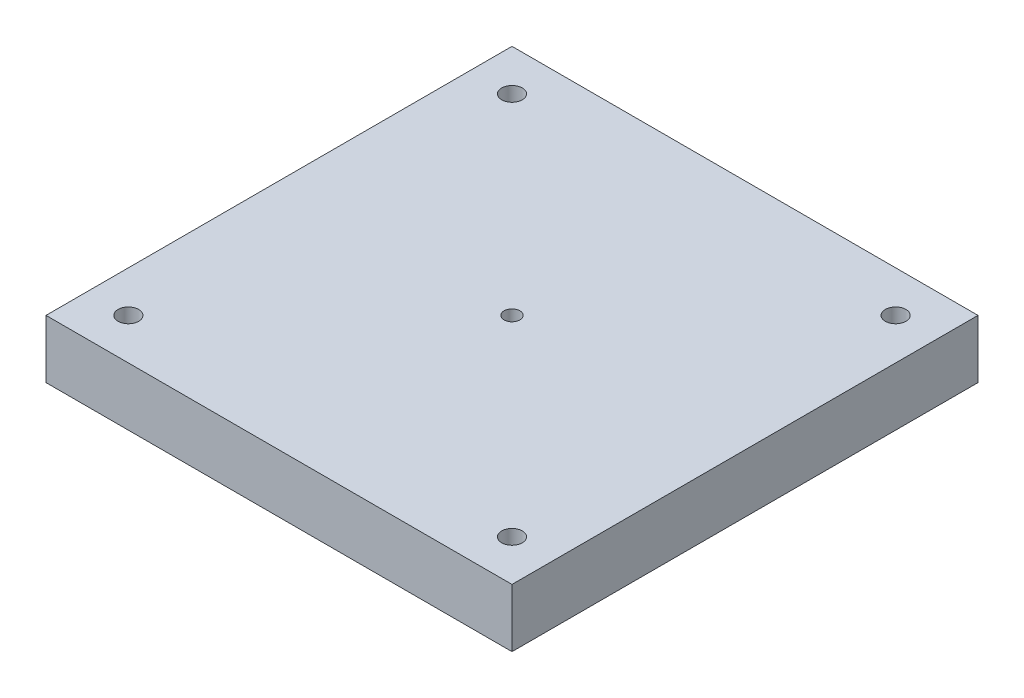
ISO-10303-21;
HEADER;
FILE_DESCRIPTION(('STEP AP214'),'2;1');
FILE_NAME('part.step','',(''),(''),'','','');
FILE_SCHEMA(('AUTOMOTIVE_DESIGN { 1 0 10303 214 1 1 1 1 }'));
ENDSEC;
DATA;
#1=APPLICATION_CONTEXT('core data for automotive mechanical design processes');
#2=APPLICATION_PROTOCOL_DEFINITION('international standard','automotive_design',2000,#1);
#3=PRODUCT_CONTEXT('',#1,'mechanical');
#4=PRODUCT('Part','Part','',(#3));
#5=PRODUCT_RELATED_PRODUCT_CATEGORY('part','',(#4));
#6=PRODUCT_DEFINITION_FORMATION('','',#4);
#7=PRODUCT_DEFINITION_CONTEXT('part definition',#1,'design');
#8=PRODUCT_DEFINITION('design','',#6,#7);
#9=PRODUCT_DEFINITION_SHAPE('','',#8);
#10=(LENGTH_UNIT() NAMED_UNIT(*) SI_UNIT(.MILLI.,.METRE.));
#11=(NAMED_UNIT(*) PLANE_ANGLE_UNIT() SI_UNIT($,.RADIAN.));
#12=(NAMED_UNIT(*) SI_UNIT($,.STERADIAN.) SOLID_ANGLE_UNIT());
#13=UNCERTAINTY_MEASURE_WITH_UNIT(LENGTH_MEASURE(1.E-05),#10,'distance_accuracy_value','');
#14=(GEOMETRIC_REPRESENTATION_CONTEXT(3) GLOBAL_UNCERTAINTY_ASSIGNED_CONTEXT((#13)) GLOBAL_UNIT_ASSIGNED_CONTEXT((#10,
#11,#12)) REPRESENTATION_CONTEXT('',''));
#15=CARTESIAN_POINT('',(0.,0.,0.));
#16=DIRECTION('',(0.,0.,1.));
#17=DIRECTION('',(1.,0.,0.));
#18=AXIS2_PLACEMENT_3D('',#15,#16,#17);
#19=CARTESIAN_POINT('',(50.8,-12.7,-50.8));
#20=DIRECTION('',(1.,0.,0.));
#21=DIRECTION('',(0.,0.,-1.));
#22=AXIS2_PLACEMENT_3D('',#19,#20,#21);
#23=PLANE('',#22);
#24=DIRECTION('',(0.,0.,-1.));
#25=VECTOR('',#24,1.);
#26=CARTESIAN_POINT('',(50.8,0.,-50.8));
#27=LINE('',#26,#25);
#28=CARTESIAN_POINT('',(50.8,0.,50.8));
#29=VERTEX_POINT('',#28);
#30=CARTESIAN_POINT('',(50.8,0.,-50.8));
#31=VERTEX_POINT('',#30);
#32=EDGE_CURVE('E113',#29,#31,#27,.T.);
#33=ORIENTED_EDGE('',*,*,#32,.F.);
#34=DIRECTION('',(0.,1.,0.));
#35=VECTOR('',#34,1.);
#36=CARTESIAN_POINT('',(50.8,-12.7,50.8));
#37=LINE('',#36,#35);
#38=CARTESIAN_POINT('',(50.8,-12.7,50.8));
#39=VERTEX_POINT('',#38);
#40=EDGE_CURVE('E11',#39,#29,#37,.T.);
#41=ORIENTED_EDGE('',*,*,#40,.F.);
#42=DIRECTION('',(0.,0.,-1.));
#43=VECTOR('',#42,1.);
#44=CARTESIAN_POINT('',(50.8,-12.7,-50.8));
#45=LINE('',#44,#43);
#46=CARTESIAN_POINT('',(50.8,-12.7,-50.8));
#47=VERTEX_POINT('',#46);
#48=EDGE_CURVE('E104',#39,#47,#45,.T.);
#49=ORIENTED_EDGE('',*,*,#48,.T.);
#50=DIRECTION('',(0.,1.,0.));
#51=VECTOR('',#50,1.);
#52=CARTESIAN_POINT('',(50.8,-12.7,-50.8));
#53=LINE('',#52,#51);
#54=EDGE_CURVE('E45',#47,#31,#53,.T.);
#55=ORIENTED_EDGE('',*,*,#54,.T.);
#56=EDGE_LOOP('',(#33,#41,#49,#55));
#57=FACE_BOUND('',#56,.T.);
#58=ADVANCED_FACE('F42',(#57),#23,.T.);
#59=CARTESIAN_POINT('',(-50.8,-12.7,50.8));
#60=DIRECTION('',(0.,0.,1.));
#61=DIRECTION('',(1.,0.,0.));
#62=AXIS2_PLACEMENT_3D('',#59,#60,#61);
#63=PLANE('',#62);
#64=DIRECTION('',(1.,0.,0.));
#65=VECTOR('',#64,1.);
#66=CARTESIAN_POINT('',(-50.8,0.,50.8));
#67=LINE('',#66,#65);
#68=CARTESIAN_POINT('',(-50.8,0.,50.8));
#69=VERTEX_POINT('',#68);
#70=EDGE_CURVE('E107',#69,#29,#67,.T.);
#71=ORIENTED_EDGE('',*,*,#70,.F.);
#72=DIRECTION('',(0.,1.,0.));
#73=VECTOR('',#72,1.);
#74=CARTESIAN_POINT('',(-50.8,-12.7,50.8));
#75=LINE('',#74,#73);
#76=CARTESIAN_POINT('',(-50.8,-12.7,50.8));
#77=VERTEX_POINT('',#76);
#78=EDGE_CURVE('E52',#77,#69,#75,.T.);
#79=ORIENTED_EDGE('',*,*,#78,.F.);
#80=DIRECTION('',(1.,0.,0.));
#81=VECTOR('',#80,1.);
#82=CARTESIAN_POINT('',(-50.8,-12.7,50.8));
#83=LINE('',#82,#81);
#84=EDGE_CURVE('E99',#77,#39,#83,.T.);
#85=ORIENTED_EDGE('',*,*,#84,.T.);
#86=ORIENTED_EDGE('',*,*,#40,.T.);
#87=EDGE_LOOP('',(#71,#79,#85,#86));
#88=FACE_BOUND('',#87,.T.);
#89=ADVANCED_FACE('F130',(#88),#63,.T.);
#90=CARTESIAN_POINT('',(-50.8,-12.7,-50.8));
#91=DIRECTION('',(-1.,0.,0.));
#92=DIRECTION('',(0.,0.,1.));
#93=AXIS2_PLACEMENT_3D('',#90,#91,#92);
#94=PLANE('',#93);
#95=DIRECTION('',(0.,0.,1.));
#96=VECTOR('',#95,1.);
#97=CARTESIAN_POINT('',(-50.8,0.,-50.8));
#98=LINE('',#97,#96);
#99=CARTESIAN_POINT('',(-50.8,0.,-50.8));
#100=VERTEX_POINT('',#99);
#101=EDGE_CURVE('E93',#100,#69,#98,.T.);
#102=ORIENTED_EDGE('',*,*,#101,.F.);
#103=DIRECTION('',(0.,1.,0.));
#104=VECTOR('',#103,1.);
#105=CARTESIAN_POINT('',(-50.8,-12.7,-50.8));
#106=LINE('',#105,#104);
#107=CARTESIAN_POINT('',(-50.8,-12.7,-50.8));
#108=VERTEX_POINT('',#107);
#109=EDGE_CURVE('E88',#108,#100,#106,.T.);
#110=ORIENTED_EDGE('',*,*,#109,.F.);
#111=DIRECTION('',(0.,0.,1.));
#112=VECTOR('',#111,1.);
#113=CARTESIAN_POINT('',(-50.8,-12.7,-50.8));
#114=LINE('',#113,#112);
#115=EDGE_CURVE('E91',#108,#77,#114,.T.);
#116=ORIENTED_EDGE('',*,*,#115,.T.);
#117=ORIENTED_EDGE('',*,*,#78,.T.);
#118=EDGE_LOOP('',(#102,#110,#116,#117));
#119=FACE_BOUND('',#118,.T.);
#120=ADVANCED_FACE('F90',(#119),#94,.T.);
#121=CARTESIAN_POINT('',(-50.8,-12.7,-50.8));
#122=DIRECTION('',(0.,0.,-1.));
#123=DIRECTION('',(-1.,0.,0.));
#124=AXIS2_PLACEMENT_3D('',#121,#122,#123);
#125=PLANE('',#124);
#126=DIRECTION('',(-1.,0.,0.));
#127=VECTOR('',#126,1.);
#128=CARTESIAN_POINT('',(-50.8,0.,-50.8));
#129=LINE('',#128,#127);
#130=EDGE_CURVE('E117',#31,#100,#129,.T.);
#131=ORIENTED_EDGE('',*,*,#130,.F.);
#132=ORIENTED_EDGE('',*,*,#54,.F.);
#133=DIRECTION('',(-1.,0.,0.));
#134=VECTOR('',#133,1.);
#135=CARTESIAN_POINT('',(-50.8,-12.7,-50.8));
#136=LINE('',#135,#134);
#137=EDGE_CURVE('E98',#47,#108,#136,.T.);
#138=ORIENTED_EDGE('',*,*,#137,.T.);
#139=ORIENTED_EDGE('',*,*,#109,.T.);
#140=EDGE_LOOP('',(#131,#132,#138,#139));
#141=FACE_BOUND('',#140,.T.);
#142=ADVANCED_FACE('F102',(#141),#125,.T.);
#143=CARTESIAN_POINT('',(0.,-12.7,0.));
#144=DIRECTION('',(0.,1.,0.));
#145=DIRECTION('',(0.,0.,1.));
#146=AXIS2_PLACEMENT_3D('',#143,#144,#145);
#147=PLANE('',#146);
#148=CARTESIAN_POINT('',(-41.8197438789284,-12.7,41.8197438789309));
#149=DIRECTION('',(0.,1.,0.));
#150=DIRECTION('',(0.,0.,1.));
#151=AXIS2_PLACEMENT_3D('',#148,#149,#150);
#152=CIRCLE('',#151,2.2479);
#153=CARTESIAN_POINT('',(-41.8197438789284,-12.7,44.0676438789309));
#154=VERTEX_POINT('',#153);
#155=EDGE_CURVE('E209',#154,#154,#152,.T.);
#156=ORIENTED_EDGE('',*,*,#155,.T.);
#157=EDGE_LOOP('',(#156));
#158=FACE_BOUND('',#157,.T.);
#159=CARTESIAN_POINT('',(41.8197438789333,-12.7,41.8197438789284));
#160=DIRECTION('',(0.,1.,0.));
#161=DIRECTION('',(0.,0.,1.));
#162=AXIS2_PLACEMENT_3D('',#159,#160,#161);
#163=CIRCLE('',#162,2.2479);
#164=CARTESIAN_POINT('',(41.8197438789333,-12.7,44.0676438789284));
#165=VERTEX_POINT('',#164);
#166=EDGE_CURVE('E201',#165,#165,#163,.T.);
#167=ORIENTED_EDGE('',*,*,#166,.T.);
#168=EDGE_LOOP('',(#167));
#169=FACE_BOUND('',#168,.T.);
#170=CARTESIAN_POINT('',(41.8197438789309,-12.7,-41.8197438789333));
#171=DIRECTION('',(0.,1.,0.));
#172=DIRECTION('',(0.,0.,1.));
#173=AXIS2_PLACEMENT_3D('',#170,#171,#172);
#174=CIRCLE('',#173,2.2479);
#175=CARTESIAN_POINT('',(41.8197438789309,-12.7,-39.5718438789333));
#176=VERTEX_POINT('',#175);
#177=EDGE_CURVE('E193',#176,#176,#174,.T.);
#178=ORIENTED_EDGE('',*,*,#177,.T.);
#179=EDGE_LOOP('',(#178));
#180=FACE_BOUND('',#179,.T.);
#181=CARTESIAN_POINT('',(-41.8197438789309,-12.7,-41.8197438789309));
#182=DIRECTION('',(0.,1.,0.));
#183=DIRECTION('',(0.,0.,1.));
#184=AXIS2_PLACEMENT_3D('',#181,#182,#183);
#185=CIRCLE('',#184,2.2479);
#186=CARTESIAN_POINT('',(-41.8197438789309,-12.7,-39.5718438789309));
#187=VERTEX_POINT('',#186);
#188=EDGE_CURVE('E176',#187,#187,#185,.T.);
#189=ORIENTED_EDGE('',*,*,#188,.T.);
#190=EDGE_LOOP('',(#189));
#191=FACE_BOUND('',#190,.T.);
#192=CARTESIAN_POINT('',(0.,-12.7,0.));
#193=DIRECTION('',(0.,1.,0.));
#194=DIRECTION('',(0.,0.,1.));
#195=AXIS2_PLACEMENT_3D('',#192,#193,#194);
#196=CIRCLE('',#195,1.7272);
#197=CARTESIAN_POINT('',(0.,-12.7,1.72719999999999));
#198=VERTEX_POINT('',#197);
#199=EDGE_CURVE('E118',#198,#198,#196,.T.);
#200=ORIENTED_EDGE('',*,*,#199,.T.);
#201=EDGE_LOOP('',(#200));
#202=FACE_BOUND('',#201,.T.);
#203=ORIENTED_EDGE('',*,*,#48,.F.);
#204=ORIENTED_EDGE('',*,*,#84,.F.);
#205=ORIENTED_EDGE('',*,*,#115,.F.);
#206=ORIENTED_EDGE('',*,*,#137,.F.);
#207=EDGE_LOOP('',(#203,#204,#205,#206));
#208=FACE_BOUND('',#207,.T.);
#209=ADVANCED_FACE('F97',(#158,#169,#180,#191,#202,#208),#147,.F.);
#210=CARTESIAN_POINT('',(0.,0.,0.));
#211=DIRECTION('',(0.,1.,0.));
#212=DIRECTION('',(0.,0.,1.));
#213=AXIS2_PLACEMENT_3D('',#210,#211,#212);
#214=PLANE('',#213);
#215=CARTESIAN_POINT('',(-41.8197438789284,0.,41.8197438789309));
#216=DIRECTION('',(0.,1.,0.));
#217=DIRECTION('',(0.,0.,1.));
#218=AXIS2_PLACEMENT_3D('',#215,#216,#217);
#219=CIRCLE('',#218,2.2479);
#220=CARTESIAN_POINT('',(-41.8197438789284,0.,44.0676438789309));
#221=VERTEX_POINT('',#220);
#222=EDGE_CURVE('E205',#221,#221,#219,.T.);
#223=ORIENTED_EDGE('',*,*,#222,.F.);
#224=EDGE_LOOP('',(#223));
#225=FACE_BOUND('',#224,.T.);
#226=CARTESIAN_POINT('',(41.8197438789333,0.,41.8197438789284));
#227=DIRECTION('',(0.,1.,0.));
#228=DIRECTION('',(0.,0.,1.));
#229=AXIS2_PLACEMENT_3D('',#226,#227,#228);
#230=CIRCLE('',#229,2.2479);
#231=CARTESIAN_POINT('',(41.8197438789333,0.,44.0676438789284));
#232=VERTEX_POINT('',#231);
#233=EDGE_CURVE('E197',#232,#232,#230,.T.);
#234=ORIENTED_EDGE('',*,*,#233,.F.);
#235=EDGE_LOOP('',(#234));
#236=FACE_BOUND('',#235,.T.);
#237=CARTESIAN_POINT('',(41.8197438789309,0.,-41.8197438789333));
#238=DIRECTION('',(0.,1.,0.));
#239=DIRECTION('',(0.,0.,1.));
#240=AXIS2_PLACEMENT_3D('',#237,#238,#239);
#241=CIRCLE('',#240,2.2479);
#242=CARTESIAN_POINT('',(41.8197438789309,0.,-39.5718438789333));
#243=VERTEX_POINT('',#242);
#244=EDGE_CURVE('E187',#243,#243,#241,.T.);
#245=ORIENTED_EDGE('',*,*,#244,.F.);
#246=EDGE_LOOP('',(#245));
#247=FACE_BOUND('',#246,.T.);
#248=CARTESIAN_POINT('',(-41.8197438789309,0.,-41.8197438789309));
#249=DIRECTION('',(0.,1.,0.));
#250=DIRECTION('',(0.,0.,1.));
#251=AXIS2_PLACEMENT_3D('',#248,#249,#250);
#252=CIRCLE('',#251,2.2479);
#253=CARTESIAN_POINT('',(-41.8197438789309,0.,-39.5718438789309));
#254=VERTEX_POINT('',#253);
#255=EDGE_CURVE('E179',#254,#254,#252,.T.);
#256=ORIENTED_EDGE('',*,*,#255,.F.);
#257=EDGE_LOOP('',(#256));
#258=FACE_BOUND('',#257,.T.);
#259=CARTESIAN_POINT('',(0.,0.,0.));
#260=DIRECTION('',(0.,1.,0.));
#261=DIRECTION('',(0.,0.,1.));
#262=AXIS2_PLACEMENT_3D('',#259,#260,#261);
#263=CIRCLE('',#262,1.7272);
#264=CARTESIAN_POINT('',(0.,0.,1.72719999999999));
#265=VERTEX_POINT('',#264);
#266=EDGE_CURVE('E182',#265,#265,#263,.T.);
#267=ORIENTED_EDGE('',*,*,#266,.F.);
#268=EDGE_LOOP('',(#267));
#269=FACE_BOUND('',#268,.T.);
#270=ORIENTED_EDGE('',*,*,#32,.T.);
#271=ORIENTED_EDGE('',*,*,#130,.T.);
#272=ORIENTED_EDGE('',*,*,#101,.T.);
#273=ORIENTED_EDGE('',*,*,#70,.T.);
#274=EDGE_LOOP('',(#270,#271,#272,#273));
#275=FACE_BOUND('',#274,.T.);
#276=ADVANCED_FACE('F129',(#225,#236,#247,#258,#269,#275),#214,.T.);
#277=CARTESIAN_POINT('',(0.,-12.7,0.));
#278=DIRECTION('',(0.,1.,0.));
#279=DIRECTION('',(0.,0.,1.));
#280=AXIS2_PLACEMENT_3D('',#277,#278,#279);
#281=CYLINDRICAL_SURFACE('',#280,1.7272);
#282=ORIENTED_EDGE('',*,*,#199,.F.);
#283=EDGE_LOOP('',(#282));
#284=FACE_BOUND('',#283,.T.);
#285=ORIENTED_EDGE('',*,*,#266,.T.);
#286=EDGE_LOOP('',(#285));
#287=FACE_BOUND('',#286,.T.);
#288=ADVANCED_FACE('F148',(#284,#287),#281,.F.);
#289=CARTESIAN_POINT('',(-41.8197438789309,-12.7,-41.8197438789309));
#290=DIRECTION('',(0.,1.,0.));
#291=DIRECTION('',(0.,0.,1.));
#292=AXIS2_PLACEMENT_3D('',#289,#290,#291);
#293=CYLINDRICAL_SURFACE('',#292,2.2479);
#294=ORIENTED_EDGE('',*,*,#188,.F.);
#295=EDGE_LOOP('',(#294));
#296=FACE_BOUND('',#295,.T.);
#297=ORIENTED_EDGE('',*,*,#255,.T.);
#298=EDGE_LOOP('',(#297));
#299=FACE_BOUND('',#298,.T.);
#300=ADVANCED_FACE('F155',(#296,#299),#293,.F.);
#301=CARTESIAN_POINT('',(41.8197438789309,-12.7,-41.8197438789333));
#302=DIRECTION('',(0.,1.,0.));
#303=DIRECTION('',(0.,0.,1.));
#304=AXIS2_PLACEMENT_3D('',#301,#302,#303);
#305=CYLINDRICAL_SURFACE('',#304,2.2479);
#306=ORIENTED_EDGE('',*,*,#177,.F.);
#307=EDGE_LOOP('',(#306));
#308=FACE_BOUND('',#307,.T.);
#309=ORIENTED_EDGE('',*,*,#244,.T.);
#310=EDGE_LOOP('',(#309));
#311=FACE_BOUND('',#310,.T.);
#312=ADVANCED_FACE('F164',(#308,#311),#305,.F.);
#313=CARTESIAN_POINT('',(41.8197438789333,-12.7,41.8197438789284));
#314=DIRECTION('',(0.,1.,0.));
#315=DIRECTION('',(0.,0.,1.));
#316=AXIS2_PLACEMENT_3D('',#313,#314,#315);
#317=CYLINDRICAL_SURFACE('',#316,2.2479);
#318=ORIENTED_EDGE('',*,*,#166,.F.);
#319=EDGE_LOOP('',(#318));
#320=FACE_BOUND('',#319,.T.);
#321=ORIENTED_EDGE('',*,*,#233,.T.);
#322=EDGE_LOOP('',(#321));
#323=FACE_BOUND('',#322,.T.);
#324=ADVANCED_FACE('F160',(#320,#323),#317,.F.);
#325=CARTESIAN_POINT('',(-41.8197438789284,-12.7,41.8197438789309));
#326=DIRECTION('',(0.,1.,0.));
#327=DIRECTION('',(0.,0.,1.));
#328=AXIS2_PLACEMENT_3D('',#325,#326,#327);
#329=CYLINDRICAL_SURFACE('',#328,2.2479);
#330=ORIENTED_EDGE('',*,*,#155,.F.);
#331=EDGE_LOOP('',(#330));
#332=FACE_BOUND('',#331,.T.);
#333=ORIENTED_EDGE('',*,*,#222,.T.);
#334=EDGE_LOOP('',(#333));
#335=FACE_BOUND('',#334,.T.);
#336=ADVANCED_FACE('F157',(#332,#335),#329,.F.);
#337=CLOSED_SHELL('',(#58,#89,#120,#142,#209,#276,#288,#300,#312,#324,#336));
#338=MANIFOLD_SOLID_BREP('B2',#337);
#339=ADVANCED_BREP_SHAPE_REPRESENTATION('',(#18,#338),#14);
#340=SHAPE_DEFINITION_REPRESENTATION(#9,#339);
ENDSEC;
END-ISO-10303-21;
